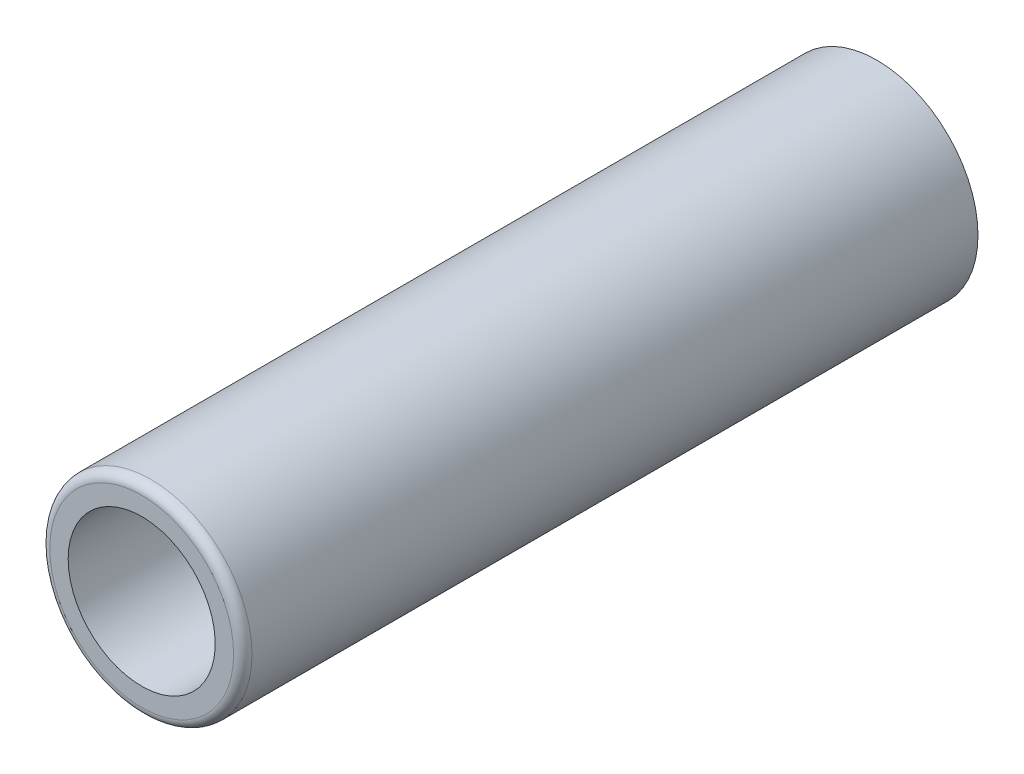
ISO-10303-21;
HEADER;
FILE_DESCRIPTION(('STEP AP214'),'2;1');
FILE_NAME('part.step','',(''),(''),'','','');
FILE_SCHEMA(('AUTOMOTIVE_DESIGN { 1 0 10303 214 1 1 1 1 }'));
ENDSEC;
DATA;
#1=APPLICATION_CONTEXT('core data for automotive mechanical design processes');
#2=APPLICATION_PROTOCOL_DEFINITION('international standard','automotive_design',2000,#1);
#3=PRODUCT_CONTEXT('',#1,'mechanical');
#4=PRODUCT('Part','Part','',(#3));
#5=PRODUCT_RELATED_PRODUCT_CATEGORY('part','',(#4));
#6=PRODUCT_DEFINITION_FORMATION('','',#4);
#7=PRODUCT_DEFINITION_CONTEXT('part definition',#1,'design');
#8=PRODUCT_DEFINITION('design','',#6,#7);
#9=PRODUCT_DEFINITION_SHAPE('','',#8);
#10=(LENGTH_UNIT() NAMED_UNIT(*) SI_UNIT(.MILLI.,.METRE.));
#11=(NAMED_UNIT(*) PLANE_ANGLE_UNIT() SI_UNIT($,.RADIAN.));
#12=(NAMED_UNIT(*) SI_UNIT($,.STERADIAN.) SOLID_ANGLE_UNIT());
#13=UNCERTAINTY_MEASURE_WITH_UNIT(LENGTH_MEASURE(1.E-05),#10,'distance_accuracy_value','');
#14=(GEOMETRIC_REPRESENTATION_CONTEXT(3) GLOBAL_UNCERTAINTY_ASSIGNED_CONTEXT((#13)) GLOBAL_UNIT_ASSIGNED_CONTEXT((#10,
#11,#12)) REPRESENTATION_CONTEXT('',''));
#15=CARTESIAN_POINT('',(0.,0.,0.));
#16=DIRECTION('',(0.,0.,1.));
#17=DIRECTION('',(1.,0.,0.));
#18=AXIS2_PLACEMENT_3D('',#15,#16,#17);
#19=CARTESIAN_POINT('',(0.,0.,400.));
#20=DIRECTION('',(0.,0.,-1.));
#21=DIRECTION('',(-1.,0.,0.));
#22=AXIS2_PLACEMENT_3D('',#19,#20,#21);
#23=CYLINDRICAL_SURFACE('',#22,55.);
#24=CARTESIAN_POINT('',(0.,0.,395.));
#25=DIRECTION('',(0.,0.,1.));
#26=DIRECTION('',(1.,0.,0.));
#27=AXIS2_PLACEMENT_3D('',#24,#25,#26);
#28=CIRCLE('',#27,55.);
#29=CARTESIAN_POINT('',(55.,0.,395.));
#30=VERTEX_POINT('',#29);
#31=EDGE_CURVE('E10',#30,#30,#28,.F.);
#32=ORIENTED_EDGE('',*,*,#31,.T.);
#33=EDGE_LOOP('',(#32));
#34=FACE_BOUND('',#33,.T.);
#35=CARTESIAN_POINT('',(0.,0.,0.));
#36=DIRECTION('',(0.,0.,1.));
#37=DIRECTION('',(1.,0.,0.));
#38=AXIS2_PLACEMENT_3D('',#35,#36,#37);
#39=CIRCLE('',#38,55.);
#40=CARTESIAN_POINT('',(55.,0.,0.));
#41=VERTEX_POINT('',#40);
#42=EDGE_CURVE('E42',#41,#41,#39,.T.);
#43=ORIENTED_EDGE('',*,*,#42,.T.);
#44=EDGE_LOOP('',(#43));
#45=FACE_BOUND('',#44,.T.);
#46=ADVANCED_FACE('F31',(#34,#45),#23,.T.);
#47=CARTESIAN_POINT('',(0.,0.,400.));
#48=DIRECTION('',(0.,0.,1.));
#49=DIRECTION('',(1.,0.,0.));
#50=AXIS2_PLACEMENT_3D('',#47,#48,#49);
#51=PLANE('',#50);
#52=CARTESIAN_POINT('',(0.,0.,400.));
#53=DIRECTION('',(0.,0.,1.));
#54=DIRECTION('',(1.,0.,0.));
#55=AXIS2_PLACEMENT_3D('',#52,#53,#54);
#56=CIRCLE('',#55,50.);
#57=CARTESIAN_POINT('',(50.,0.,400.));
#58=VERTEX_POINT('',#57);
#59=EDGE_CURVE('E38',#58,#58,#56,.T.);
#60=ORIENTED_EDGE('',*,*,#59,.T.);
#61=EDGE_LOOP('',(#60));
#62=FACE_BOUND('',#61,.T.);
#63=CARTESIAN_POINT('',(0.,0.,400.));
#64=DIRECTION('',(0.,0.,-1.));
#65=DIRECTION('',(-1.,0.,0.));
#66=AXIS2_PLACEMENT_3D('',#63,#64,#65);
#67=CIRCLE('',#66,40.);
#68=CARTESIAN_POINT('',(-40.,0.,400.));
#69=VERTEX_POINT('',#68);
#70=EDGE_CURVE('E46',#69,#69,#67,.T.);
#71=ORIENTED_EDGE('',*,*,#70,.T.);
#72=EDGE_LOOP('',(#71));
#73=FACE_BOUND('',#72,.T.);
#74=ADVANCED_FACE('F55',(#62,#73),#51,.T.);
#75=CARTESIAN_POINT('',(0.,0.,0.));
#76=DIRECTION('',(0.,0.,1.));
#77=DIRECTION('',(1.,0.,0.));
#78=AXIS2_PLACEMENT_3D('',#75,#76,#77);
#79=PLANE('',#78);
#80=CARTESIAN_POINT('',(0.,0.,0.));
#81=DIRECTION('',(0.,0.,-1.));
#82=DIRECTION('',(-1.,0.,0.));
#83=AXIS2_PLACEMENT_3D('',#80,#81,#82);
#84=CIRCLE('',#83,40.);
#85=CARTESIAN_POINT('',(-40.,0.,0.));
#86=VERTEX_POINT('',#85);
#87=EDGE_CURVE('E49',#86,#86,#84,.T.);
#88=ORIENTED_EDGE('',*,*,#87,.F.);
#89=EDGE_LOOP('',(#88));
#90=FACE_BOUND('',#89,.T.);
#91=ORIENTED_EDGE('',*,*,#42,.F.);
#92=EDGE_LOOP('',(#91));
#93=FACE_BOUND('',#92,.T.);
#94=ADVANCED_FACE('F60',(#90,#93),#79,.F.);
#95=CARTESIAN_POINT('',(0.,0.,400.));
#96=DIRECTION('',(0.,0.,-1.));
#97=DIRECTION('',(-1.,0.,0.));
#98=AXIS2_PLACEMENT_3D('',#95,#96,#97);
#99=CYLINDRICAL_SURFACE('',#98,40.);
#100=ORIENTED_EDGE('',*,*,#70,.F.);
#101=EDGE_LOOP('',(#100));
#102=FACE_BOUND('',#101,.T.);
#103=ORIENTED_EDGE('',*,*,#87,.T.);
#104=EDGE_LOOP('',(#103));
#105=FACE_BOUND('',#104,.T.);
#106=ADVANCED_FACE('F57',(#102,#105),#99,.F.);
#107=CARTESIAN_POINT('',(0.,0.,395.));
#108=DIRECTION('',(0.,0.,1.));
#109=DIRECTION('',(1.,0.,0.));
#110=AXIS2_PLACEMENT_3D('',#107,#108,#109);
#111=TOROIDAL_SURFACE('',#110,50.,5.);
#112=ORIENTED_EDGE('',*,*,#31,.F.);
#113=EDGE_LOOP('',(#112));
#114=FACE_BOUND('',#113,.T.);
#115=ORIENTED_EDGE('',*,*,#59,.F.);
#116=EDGE_LOOP('',(#115));
#117=FACE_BOUND('',#116,.T.);
#118=ADVANCED_FACE('F33',(#114,#117),#111,.T.);
#119=CLOSED_SHELL('',(#46,#74,#94,#106,#118));
#120=MANIFOLD_SOLID_BREP('B2',#119);
#121=ADVANCED_BREP_SHAPE_REPRESENTATION('',(#18,#120),#14);
#122=SHAPE_DEFINITION_REPRESENTATION(#9,#121);
ENDSEC;
END-ISO-10303-21;
